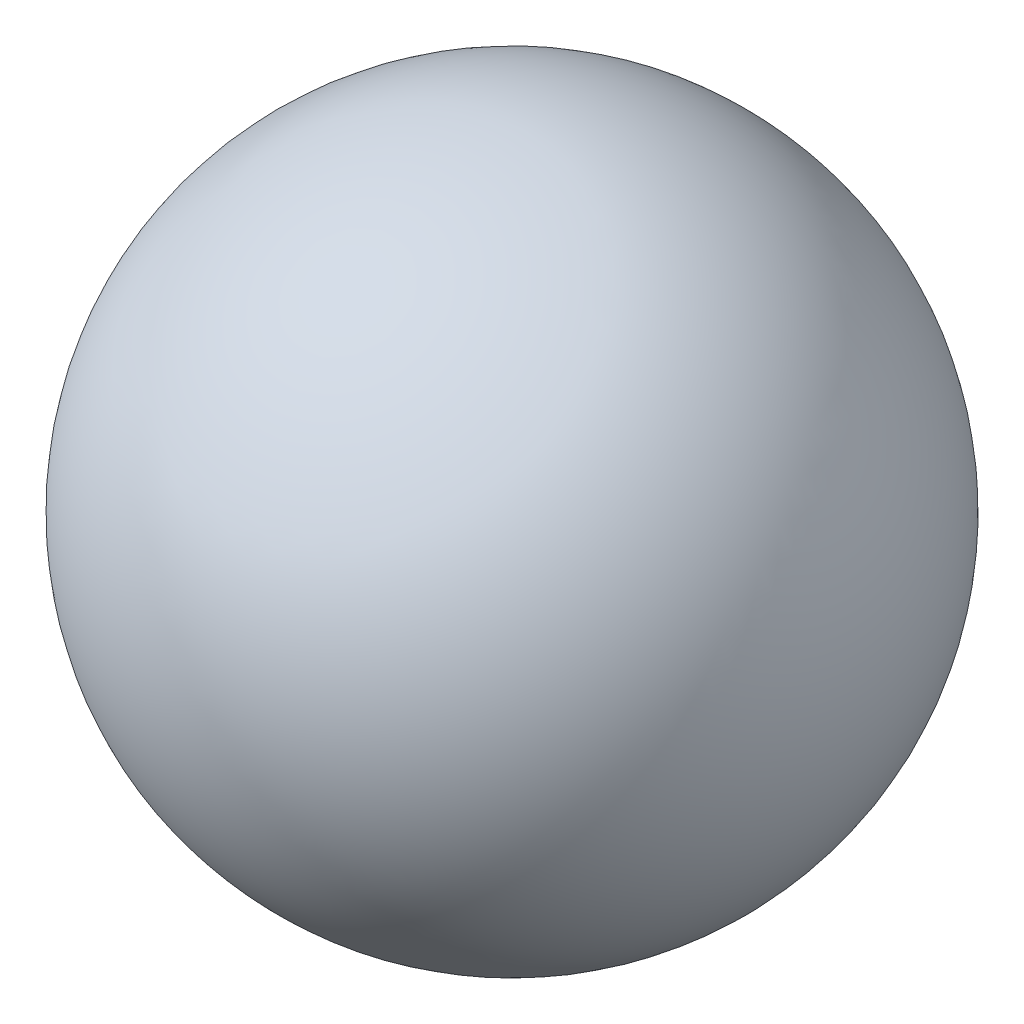
ISO-10303-21;
HEADER;
FILE_DESCRIPTION(('STEP AP214'),'2;1');
FILE_NAME('part.step','',(''),(''),'','','');
FILE_SCHEMA(('AUTOMOTIVE_DESIGN { 1 0 10303 214 1 1 1 1 }'));
ENDSEC;
DATA;
#1=APPLICATION_CONTEXT('core data for automotive mechanical design processes');
#2=APPLICATION_PROTOCOL_DEFINITION('international standard','automotive_design',2000,#1);
#3=PRODUCT_CONTEXT('',#1,'mechanical');
#4=PRODUCT('Part','Part','',(#3));
#5=PRODUCT_RELATED_PRODUCT_CATEGORY('part','',(#4));
#6=PRODUCT_DEFINITION_FORMATION('','',#4);
#7=PRODUCT_DEFINITION_CONTEXT('part definition',#1,'design');
#8=PRODUCT_DEFINITION('design','',#6,#7);
#9=PRODUCT_DEFINITION_SHAPE('','',#8);
#10=(LENGTH_UNIT() NAMED_UNIT(*) SI_UNIT(.MILLI.,.METRE.));
#11=(NAMED_UNIT(*) PLANE_ANGLE_UNIT() SI_UNIT($,.RADIAN.));
#12=(NAMED_UNIT(*) SI_UNIT($,.STERADIAN.) SOLID_ANGLE_UNIT());
#13=UNCERTAINTY_MEASURE_WITH_UNIT(LENGTH_MEASURE(1.E-05),#10,'distance_accuracy_value','');
#14=(GEOMETRIC_REPRESENTATION_CONTEXT(3) GLOBAL_UNCERTAINTY_ASSIGNED_CONTEXT((#13)) GLOBAL_UNIT_ASSIGNED_CONTEXT((#10,
#11,#12)) REPRESENTATION_CONTEXT('',''));
#15=CARTESIAN_POINT('',(0.,0.,0.));
#16=DIRECTION('',(0.,0.,1.));
#17=DIRECTION('',(1.,0.,0.));
#18=AXIS2_PLACEMENT_3D('',#15,#16,#17);
#19=CARTESIAN_POINT('',(-1.98437500000003,-3.43703832126947,0.));
#20=DIRECTION('',(-0.500000000000007,-0.866025403784435,0.));
#21=DIRECTION('',(0.866025403784435,-0.500000000000007,0.));
#22=AXIS2_PLACEMENT_3D('',#19,#20,#21);
#23=SPHERICAL_SURFACE('',#22,0.758760243513405);
#24=CARTESIAN_POINT('',(-2.36375512175674,-4.09414396753375,0.));
#25=VERTEX_POINT('',#24);
#26=VERTEX_LOOP('',#25);
#27=FACE_BOUND('',#26,.T.);
#28=ADVANCED_FACE('F34',(#27),#23,.T.);
#29=CLOSED_SHELL('',(#28));
#30=MANIFOLD_SOLID_BREP('B2',#29);
#31=ADVANCED_BREP_SHAPE_REPRESENTATION('',(#18,#30),#14);
#32=SHAPE_DEFINITION_REPRESENTATION(#9,#31);
ENDSEC;
END-ISO-10303-21;
